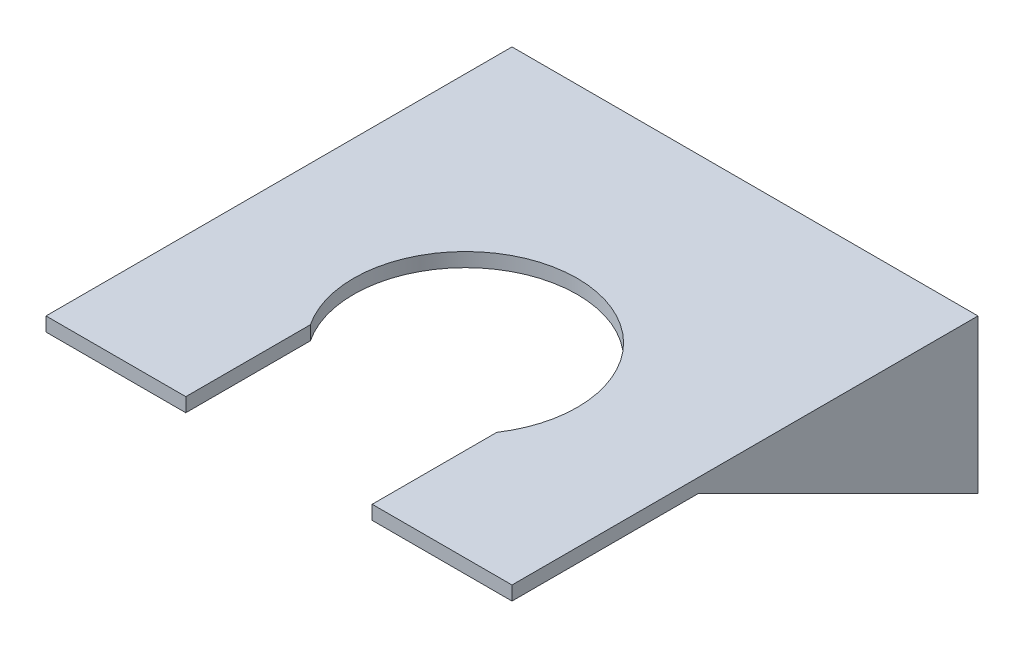
ISO-10303-21;
HEADER;
FILE_DESCRIPTION(('STEP AP214'),'2;1');
FILE_NAME('part.step','',(''),(''),'','','');
FILE_SCHEMA(('AUTOMOTIVE_DESIGN { 1 0 10303 214 1 1 1 1 }'));
ENDSEC;
DATA;
#1=APPLICATION_CONTEXT('core data for automotive mechanical design processes');
#2=APPLICATION_PROTOCOL_DEFINITION('international standard','automotive_design',2000,#1);
#3=PRODUCT_CONTEXT('',#1,'mechanical');
#4=PRODUCT('Part','Part','',(#3));
#5=PRODUCT_RELATED_PRODUCT_CATEGORY('part','',(#4));
#6=PRODUCT_DEFINITION_FORMATION('','',#4);
#7=PRODUCT_DEFINITION_CONTEXT('part definition',#1,'design');
#8=PRODUCT_DEFINITION('design','',#6,#7);
#9=PRODUCT_DEFINITION_SHAPE('','',#8);
#10=(LENGTH_UNIT() NAMED_UNIT(*) SI_UNIT(.MILLI.,.METRE.));
#11=(NAMED_UNIT(*) PLANE_ANGLE_UNIT() SI_UNIT($,.RADIAN.));
#12=(NAMED_UNIT(*) SI_UNIT($,.STERADIAN.) SOLID_ANGLE_UNIT());
#13=UNCERTAINTY_MEASURE_WITH_UNIT(LENGTH_MEASURE(1.E-05),#10,'distance_accuracy_value','');
#14=(GEOMETRIC_REPRESENTATION_CONTEXT(3) GLOBAL_UNCERTAINTY_ASSIGNED_CONTEXT((#13)) GLOBAL_UNIT_ASSIGNED_CONTEXT((#10,
#11,#12)) REPRESENTATION_CONTEXT('',''));
#15=CARTESIAN_POINT('',(0.,0.,0.));
#16=DIRECTION('',(0.,0.,1.));
#17=DIRECTION('',(1.,0.,0.));
#18=AXIS2_PLACEMENT_3D('',#15,#16,#17);
#19=CARTESIAN_POINT('',(-25.,-2.56176848089127,50.));
#20=DIRECTION('',(0.,1.,0.));
#21=DIRECTION('',(-1.,0.,0.));
#22=AXIS2_PLACEMENT_3D('',#19,#20,#21);
#23=PLANE('',#22);
#24=DIRECTION('',(1.,0.,0.));
#25=VECTOR('',#24,1.);
#26=CARTESIAN_POINT('',(23.5,-2.56176848089129,30.));
#27=LINE('',#26,#25);
#28=CARTESIAN_POINT('',(23.5,-2.56176848089126,30.));
#29=VERTEX_POINT('',#28);
#30=CARTESIAN_POINT('',(25.,-2.56176848089126,30.));
#31=VERTEX_POINT('',#30);
#32=EDGE_CURVE('E53',#29,#31,#27,.T.);
#33=ORIENTED_EDGE('',*,*,#32,.T.);
#34=DIRECTION('',(0.,0.,-1.));
#35=VECTOR('',#34,1.);
#36=CARTESIAN_POINT('',(25.,-2.56176848089126,50.));
#37=LINE('',#36,#35);
#38=CARTESIAN_POINT('',(25.,-2.56176848089126,50.));
#39=VERTEX_POINT('',#38);
#40=EDGE_CURVE('E41',#39,#31,#37,.T.);
#41=ORIENTED_EDGE('',*,*,#40,.F.);
#42=DIRECTION('',(1.,0.,0.));
#43=VECTOR('',#42,1.);
#44=CARTESIAN_POINT('',(-25.,-2.56176848089127,50.));
#45=LINE('',#44,#43);
#46=CARTESIAN_POINT('',(10.,-2.56176848089127,50.));
#47=VERTEX_POINT('',#46);
#48=EDGE_CURVE('E190',#47,#39,#45,.T.);
#49=ORIENTED_EDGE('',*,*,#48,.F.);
#50=DIRECTION('',(0.,0.,1.));
#51=VECTOR('',#50,1.);
#52=CARTESIAN_POINT('',(10.,-2.56176848089126,36.6332495807108));
#53=LINE('',#52,#51);
#54=CARTESIAN_POINT('',(10.,-2.56176848089126,36.6332495807108));
#55=VERTEX_POINT('',#54);
#56=EDGE_CURVE('E164',#55,#47,#53,.T.);
#57=ORIENTED_EDGE('',*,*,#56,.F.);
#58=CARTESIAN_POINT('',(0.,-2.56176848089126,30.));
#59=DIRECTION('',(0.,1.,0.));
#60=DIRECTION('',(-1.,0.,0.));
#61=AXIS2_PLACEMENT_3D('',#58,#59,#60);
#62=CIRCLE('',#61,12.);
#63=CARTESIAN_POINT('',(-10.,-2.56176848089127,36.6332495807108));
#64=VERTEX_POINT('',#63);
#65=EDGE_CURVE('E166',#64,#55,#62,.F.);
#66=ORIENTED_EDGE('',*,*,#65,.F.);
#67=DIRECTION('',(0.,0.,-1.));
#68=VECTOR('',#67,1.);
#69=CARTESIAN_POINT('',(-10.,-2.56176848089127,36.6332495807108));
#70=LINE('',#69,#68);
#71=CARTESIAN_POINT('',(-10.,-2.56176848089127,50.));
#72=VERTEX_POINT('',#71);
#73=EDGE_CURVE('E169',#72,#64,#70,.T.);
#74=ORIENTED_EDGE('',*,*,#73,.F.);
#75=CARTESIAN_POINT('',(-25.,-2.56176848089127,50.));
#76=VERTEX_POINT('',#75);
#77=EDGE_CURVE('E192',#76,#72,#45,.T.);
#78=ORIENTED_EDGE('',*,*,#77,.F.);
#79=DIRECTION('',(0.,0.,-1.));
#80=VECTOR('',#79,1.);
#81=CARTESIAN_POINT('',(-25.,-2.56176848089127,50.));
#82=LINE('',#81,#80);
#83=CARTESIAN_POINT('',(-25.,-2.56176848089129,30.));
#84=VERTEX_POINT('',#83);
#85=EDGE_CURVE('E11',#76,#84,#82,.T.);
#86=ORIENTED_EDGE('',*,*,#85,.T.);
#87=DIRECTION('',(-1.,0.,0.));
#88=VECTOR('',#87,1.);
#89=CARTESIAN_POINT('',(-23.5,-2.56176848089129,30.));
#90=LINE('',#89,#88);
#91=CARTESIAN_POINT('',(-23.5,-2.56176848089129,30.));
#92=VERTEX_POINT('',#91);
#93=EDGE_CURVE('E159',#92,#84,#90,.T.);
#94=ORIENTED_EDGE('',*,*,#93,.F.);
#95=DIRECTION('',(0.,0.,-1.));
#96=VECTOR('',#95,1.);
#97=CARTESIAN_POINT('',(-23.5,-2.56176848089129,30.));
#98=LINE('',#97,#96);
#99=CARTESIAN_POINT('',(-23.5,-2.56176848089127,0.));
#100=VERTEX_POINT('',#99);
#101=EDGE_CURVE('E147',#92,#100,#98,.T.);
#102=ORIENTED_EDGE('',*,*,#101,.T.);
#103=DIRECTION('',(1.,0.,0.));
#104=VECTOR('',#103,1.);
#105=CARTESIAN_POINT('',(-25.,-2.56176848089127,0.));
#106=LINE('',#105,#104);
#107=CARTESIAN_POINT('',(23.5,-2.56176848089126,0.));
#108=VERTEX_POINT('',#107);
#109=EDGE_CURVE('E203',#100,#108,#106,.T.);
#110=ORIENTED_EDGE('',*,*,#109,.T.);
#111=DIRECTION('',(0.,0.,-1.));
#112=VECTOR('',#111,1.);
#113=CARTESIAN_POINT('',(23.5,-2.56176848089129,30.));
#114=LINE('',#113,#112);
#115=EDGE_CURVE('E48',#29,#108,#114,.T.);
#116=ORIENTED_EDGE('',*,*,#115,.F.);
#117=EDGE_LOOP('',(#33,#41,#49,#57,#66,#74,#78,#86,#94,#102,#110,#116));
#118=FACE_BOUND('',#117,.T.);
#119=ADVANCED_FACE('F33',(#118),#23,.F.);
#120=CARTESIAN_POINT('',(0.,0.,50.));
#121=DIRECTION('',(0.,0.,1.));
#122=DIRECTION('',(1.,0.,0.));
#123=AXIS2_PLACEMENT_3D('',#120,#121,#122);
#124=PLANE('',#123);
#125=DIRECTION('',(0.,1.,0.));
#126=VECTOR('',#125,1.);
#127=CARTESIAN_POINT('',(10.,-42.5617684808913,50.));
#128=LINE('',#127,#126);
#129=CARTESIAN_POINT('',(10.,-1.06176848089127,50.));
#130=VERTEX_POINT('',#129);
#131=EDGE_CURVE('E179',#47,#130,#128,.T.);
#132=ORIENTED_EDGE('',*,*,#131,.F.);
#133=ORIENTED_EDGE('',*,*,#48,.T.);
#134=DIRECTION('',(0.,1.,0.));
#135=VECTOR('',#134,1.);
#136=CARTESIAN_POINT('',(25.,-1.06176848089126,50.));
#137=LINE('',#136,#135);
#138=CARTESIAN_POINT('',(25.,-1.06176848089126,50.));
#139=VERTEX_POINT('',#138);
#140=EDGE_CURVE('E195',#39,#139,#137,.T.);
#141=ORIENTED_EDGE('',*,*,#140,.T.);
#142=DIRECTION('',(-1.,0.,0.));
#143=VECTOR('',#142,1.);
#144=CARTESIAN_POINT('',(-25.,-1.06176848089127,50.));
#145=LINE('',#144,#143);
#146=EDGE_CURVE('E198',#139,#130,#145,.T.);
#147=ORIENTED_EDGE('',*,*,#146,.T.);
#148=EDGE_LOOP('',(#132,#133,#141,#147));
#149=FACE_BOUND('',#148,.T.);
#150=ADVANCED_FACE('F220',(#149),#124,.T.);
#151=CARTESIAN_POINT('',(-25.,-1.06176848089127,50.));
#152=DIRECTION('',(1.,0.,0.));
#153=DIRECTION('',(0.,0.,-1.));
#154=AXIS2_PLACEMENT_3D('',#151,#152,#153);
#155=PLANE('',#154);
#156=DIRECTION('',(0.,-1.,0.));
#157=VECTOR('',#156,1.);
#158=CARTESIAN_POINT('',(-25.,-1.06176848089127,0.));
#159=LINE('',#158,#157);
#160=CARTESIAN_POINT('',(-25.,-1.06176848089127,0.));
#161=VERTEX_POINT('',#160);
#162=CARTESIAN_POINT('',(-25.,-17.5617684808913,0.));
#163=VERTEX_POINT('',#162);
#164=EDGE_CURVE('E186',#161,#163,#159,.T.);
#165=ORIENTED_EDGE('',*,*,#164,.T.);
#166=DIRECTION('',(0.,0.447213595499958,0.894427190999916));
#167=VECTOR('',#166,1.);
#168=CARTESIAN_POINT('',(-25.,-17.5617684808913,0.));
#169=LINE('',#168,#167);
#170=EDGE_CURVE('E138',#163,#84,#169,.T.);
#171=ORIENTED_EDGE('',*,*,#170,.T.);
#172=ORIENTED_EDGE('',*,*,#85,.F.);
#173=DIRECTION('',(0.,-1.,0.));
#174=VECTOR('',#173,1.);
#175=CARTESIAN_POINT('',(-25.,-1.06176848089127,50.));
#176=LINE('',#175,#174);
#177=CARTESIAN_POINT('',(-25.,-1.06176848089127,50.));
#178=VERTEX_POINT('',#177);
#179=EDGE_CURVE('E187',#178,#76,#176,.T.);
#180=ORIENTED_EDGE('',*,*,#179,.F.);
#181=DIRECTION('',(0.,0.,-1.));
#182=VECTOR('',#181,1.);
#183=CARTESIAN_POINT('',(-25.,-1.06176848089127,50.));
#184=LINE('',#183,#182);
#185=EDGE_CURVE('E201',#178,#161,#184,.T.);
#186=ORIENTED_EDGE('',*,*,#185,.T.);
#187=EDGE_LOOP('',(#165,#171,#172,#180,#186));
#188=FACE_BOUND('',#187,.T.);
#189=ADVANCED_FACE('F35',(#188),#155,.F.);
#190=CARTESIAN_POINT('',(25.,-1.06176848089126,50.));
#191=DIRECTION('',(-1.,0.,0.));
#192=DIRECTION('',(0.,0.,1.));
#193=AXIS2_PLACEMENT_3D('',#190,#191,#192);
#194=PLANE('',#193);
#195=DIRECTION('',(0.,1.,0.));
#196=VECTOR('',#195,1.);
#197=CARTESIAN_POINT('',(25.,-1.06176848089126,0.));
#198=LINE('',#197,#196);
#199=CARTESIAN_POINT('',(25.,-17.5617684808913,0.));
#200=VERTEX_POINT('',#199);
#201=CARTESIAN_POINT('',(25.,-1.06176848089126,0.));
#202=VERTEX_POINT('',#201);
#203=EDGE_CURVE('E134',#200,#202,#198,.T.);
#204=ORIENTED_EDGE('',*,*,#203,.T.);
#205=DIRECTION('',(0.,0.,-1.));
#206=VECTOR('',#205,1.);
#207=CARTESIAN_POINT('',(25.,-1.06176848089126,50.));
#208=LINE('',#207,#206);
#209=EDGE_CURVE('E209',#139,#202,#208,.T.);
#210=ORIENTED_EDGE('',*,*,#209,.F.);
#211=ORIENTED_EDGE('',*,*,#140,.F.);
#212=ORIENTED_EDGE('',*,*,#40,.T.);
#213=DIRECTION('',(0.,0.447213595499958,0.894427190999916));
#214=VECTOR('',#213,1.);
#215=CARTESIAN_POINT('',(25.,-17.5617684808913,0.));
#216=LINE('',#215,#214);
#217=EDGE_CURVE('E142',#200,#31,#216,.T.);
#218=ORIENTED_EDGE('',*,*,#217,.F.);
#219=EDGE_LOOP('',(#204,#210,#211,#212,#218));
#220=FACE_BOUND('',#219,.T.);
#221=ADVANCED_FACE('F213',(#220),#194,.F.);
#222=CARTESIAN_POINT('',(-25.,-1.06176848089127,50.));
#223=DIRECTION('',(0.,-1.,0.));
#224=DIRECTION('',(1.,0.,0.));
#225=AXIS2_PLACEMENT_3D('',#222,#223,#224);
#226=PLANE('',#225);
#227=CARTESIAN_POINT('',(0.,-1.06176848089127,30.));
#228=DIRECTION('',(0.,1.,0.));
#229=DIRECTION('',(0.,0.,1.));
#230=AXIS2_PLACEMENT_3D('',#227,#228,#229);
#231=CIRCLE('',#230,12.);
#232=CARTESIAN_POINT('',(10.,-1.06176848089127,36.6332495807108));
#233=VERTEX_POINT('',#232);
#234=CARTESIAN_POINT('',(-10.,-1.06176848089127,36.6332495807108));
#235=VERTEX_POINT('',#234);
#236=EDGE_CURVE('E161',#233,#235,#231,.T.);
#237=ORIENTED_EDGE('',*,*,#236,.F.);
#238=DIRECTION('',(0.,0.,-1.));
#239=VECTOR('',#238,1.);
#240=CARTESIAN_POINT('',(10.,-1.06176848089127,36.6332495807108));
#241=LINE('',#240,#239);
#242=EDGE_CURVE('E174',#130,#233,#241,.T.);
#243=ORIENTED_EDGE('',*,*,#242,.F.);
#244=ORIENTED_EDGE('',*,*,#146,.F.);
#245=ORIENTED_EDGE('',*,*,#209,.T.);
#246=DIRECTION('',(-1.,0.,0.));
#247=VECTOR('',#246,1.);
#248=CARTESIAN_POINT('',(-25.,-1.06176848089127,0.));
#249=LINE('',#248,#247);
#250=EDGE_CURVE('E191',#202,#161,#249,.T.);
#251=ORIENTED_EDGE('',*,*,#250,.T.);
#252=ORIENTED_EDGE('',*,*,#185,.F.);
#253=CARTESIAN_POINT('',(-10.,-1.06176848089127,50.));
#254=VERTEX_POINT('',#253);
#255=EDGE_CURVE('E197',#254,#178,#145,.T.);
#256=ORIENTED_EDGE('',*,*,#255,.F.);
#257=DIRECTION('',(0.,0.,1.));
#258=VECTOR('',#257,1.);
#259=CARTESIAN_POINT('',(-10.,-1.06176848089127,36.6332495807108));
#260=LINE('',#259,#258);
#261=EDGE_CURVE('E172',#235,#254,#260,.T.);
#262=ORIENTED_EDGE('',*,*,#261,.F.);
#263=EDGE_LOOP('',(#237,#243,#244,#245,#251,#252,#256,#262));
#264=FACE_BOUND('',#263,.T.);
#265=ADVANCED_FACE('F228',(#264),#226,.F.);
#266=DIRECTION('',(0.,1.,0.));
#267=VECTOR('',#266,1.);
#268=CARTESIAN_POINT('',(-10.,-42.5617684808913,50.));
#269=LINE('',#268,#267);
#270=EDGE_CURVE('E181',#72,#254,#269,.T.);
#271=ORIENTED_EDGE('',*,*,#270,.T.);
#272=ORIENTED_EDGE('',*,*,#255,.T.);
#273=ORIENTED_EDGE('',*,*,#179,.T.);
#274=ORIENTED_EDGE('',*,*,#77,.T.);
#275=EDGE_LOOP('',(#271,#272,#273,#274));
#276=FACE_BOUND('',#275,.T.);
#277=ADVANCED_FACE('F237',(#276),#124,.T.);
#278=CARTESIAN_POINT('',(0.,0.,0.));
#279=DIRECTION('',(0.,0.,1.));
#280=DIRECTION('',(1.,0.,0.));
#281=AXIS2_PLACEMENT_3D('',#278,#279,#280);
#282=PLANE('',#281);
#283=ORIENTED_EDGE('',*,*,#164,.F.);
#284=ORIENTED_EDGE('',*,*,#250,.F.);
#285=ORIENTED_EDGE('',*,*,#203,.F.);
#286=DIRECTION('',(1.,0.,0.));
#287=VECTOR('',#286,1.);
#288=CARTESIAN_POINT('',(23.5,-17.5617684808913,0.));
#289=LINE('',#288,#287);
#290=CARTESIAN_POINT('',(23.5,-17.5617684808913,0.));
#291=VERTEX_POINT('',#290);
#292=EDGE_CURVE('E130',#291,#200,#289,.T.);
#293=ORIENTED_EDGE('',*,*,#292,.F.);
#294=DIRECTION('',(0.,-1.,0.));
#295=VECTOR('',#294,1.);
#296=CARTESIAN_POINT('',(23.5,-2.56176848089129,0.));
#297=LINE('',#296,#295);
#298=EDGE_CURVE('E121',#108,#291,#297,.T.);
#299=ORIENTED_EDGE('',*,*,#298,.F.);
#300=ORIENTED_EDGE('',*,*,#109,.F.);
#301=DIRECTION('',(0.,-1.,0.));
#302=VECTOR('',#301,1.);
#303=CARTESIAN_POINT('',(-23.5,-2.56176848089129,0.));
#304=LINE('',#303,#302);
#305=CARTESIAN_POINT('',(-23.5,-17.5617684808913,0.));
#306=VERTEX_POINT('',#305);
#307=EDGE_CURVE('E150',#100,#306,#304,.T.);
#308=ORIENTED_EDGE('',*,*,#307,.T.);
#309=DIRECTION('',(-1.,0.,0.));
#310=VECTOR('',#309,1.);
#311=CARTESIAN_POINT('',(-23.5,-17.5617684808913,0.));
#312=LINE('',#311,#310);
#313=EDGE_CURVE('E156',#306,#163,#312,.T.);
#314=ORIENTED_EDGE('',*,*,#313,.T.);
#315=EDGE_LOOP('',(#283,#284,#285,#293,#299,#300,#308,#314));
#316=FACE_BOUND('',#315,.T.);
#317=ADVANCED_FACE('F132',(#316),#282,.F.);
#318=CARTESIAN_POINT('',(0.,-42.5617684808913,30.));
#319=DIRECTION('',(0.,1.,0.));
#320=DIRECTION('',(0.,0.,1.));
#321=AXIS2_PLACEMENT_3D('',#318,#319,#320);
#322=CYLINDRICAL_SURFACE('',#321,12.);
#323=ORIENTED_EDGE('',*,*,#65,.T.);
#324=DIRECTION('',(0.,1.,0.));
#325=VECTOR('',#324,1.);
#326=CARTESIAN_POINT('',(10.,-42.5617684808913,36.6332495807108));
#327=LINE('',#326,#325);
#328=EDGE_CURVE('E167',#55,#233,#327,.T.);
#329=ORIENTED_EDGE('',*,*,#328,.T.);
#330=ORIENTED_EDGE('',*,*,#236,.T.);
#331=DIRECTION('',(0.,1.,0.));
#332=VECTOR('',#331,1.);
#333=CARTESIAN_POINT('',(-10.,-42.5617684808913,36.6332495807108));
#334=LINE('',#333,#332);
#335=EDGE_CURVE('E177',#64,#235,#334,.T.);
#336=ORIENTED_EDGE('',*,*,#335,.F.);
#337=EDGE_LOOP('',(#323,#329,#330,#336));
#338=FACE_BOUND('',#337,.T.);
#339=ADVANCED_FACE('F233',(#338),#322,.F.);
#340=CARTESIAN_POINT('',(10.,-42.5617684808913,36.6332495807108));
#341=DIRECTION('',(1.,0.,0.));
#342=DIRECTION('',(0.,0.,-1.));
#343=AXIS2_PLACEMENT_3D('',#340,#341,#342);
#344=PLANE('',#343);
#345=ORIENTED_EDGE('',*,*,#56,.T.);
#346=ORIENTED_EDGE('',*,*,#131,.T.);
#347=ORIENTED_EDGE('',*,*,#242,.T.);
#348=ORIENTED_EDGE('',*,*,#328,.F.);
#349=EDGE_LOOP('',(#345,#346,#347,#348));
#350=FACE_BOUND('',#349,.T.);
#351=ADVANCED_FACE('F224',(#350),#344,.F.);
#352=CARTESIAN_POINT('',(-10.,-42.5617684808913,36.6332495807108));
#353=DIRECTION('',(-1.,0.,0.));
#354=DIRECTION('',(0.,0.,1.));
#355=AXIS2_PLACEMENT_3D('',#352,#353,#354);
#356=PLANE('',#355);
#357=ORIENTED_EDGE('',*,*,#73,.T.);
#358=ORIENTED_EDGE('',*,*,#335,.T.);
#359=ORIENTED_EDGE('',*,*,#261,.T.);
#360=ORIENTED_EDGE('',*,*,#270,.F.);
#361=EDGE_LOOP('',(#357,#358,#359,#360));
#362=FACE_BOUND('',#361,.T.);
#363=ADVANCED_FACE('F256',(#362),#356,.F.);
#364=CARTESIAN_POINT('',(-23.5,-17.5617684808913,0.));
#365=DIRECTION('',(0.,-0.894427190999916,0.447213595499958));
#366=DIRECTION('',(0.,-0.447213595499958,-0.894427190999916));
#367=AXIS2_PLACEMENT_3D('',#364,#365,#366);
#368=PLANE('',#367);
#369=ORIENTED_EDGE('',*,*,#170,.F.);
#370=ORIENTED_EDGE('',*,*,#313,.F.);
#371=DIRECTION('',(0.,0.447213595499958,0.894427190999916));
#372=VECTOR('',#371,1.);
#373=CARTESIAN_POINT('',(-23.5,-17.5617684808913,0.));
#374=LINE('',#373,#372);
#375=EDGE_CURVE('E153',#306,#92,#374,.T.);
#376=ORIENTED_EDGE('',*,*,#375,.T.);
#377=ORIENTED_EDGE('',*,*,#93,.T.);
#378=EDGE_LOOP('',(#369,#370,#376,#377));
#379=FACE_BOUND('',#378,.T.);
#380=ADVANCED_FACE('F245',(#379),#368,.T.);
#381=CARTESIAN_POINT('',(-23.5,0.,0.));
#382=DIRECTION('',(-1.,0.,0.));
#383=DIRECTION('',(0.,0.,1.));
#384=AXIS2_PLACEMENT_3D('',#381,#382,#383);
#385=PLANE('',#384);
#386=ORIENTED_EDGE('',*,*,#101,.F.);
#387=ORIENTED_EDGE('',*,*,#375,.F.);
#388=ORIENTED_EDGE('',*,*,#307,.F.);
#389=EDGE_LOOP('',(#386,#387,#388));
#390=FACE_BOUND('',#389,.T.);
#391=ADVANCED_FACE('F248',(#390),#385,.F.);
#392=CARTESIAN_POINT('',(23.5,-17.5617684808913,0.));
#393=DIRECTION('',(0.,0.894427190999916,-0.447213595499958));
#394=DIRECTION('',(0.,0.447213595499958,0.894427190999916));
#395=AXIS2_PLACEMENT_3D('',#392,#393,#394);
#396=PLANE('',#395);
#397=ORIENTED_EDGE('',*,*,#217,.T.);
#398=ORIENTED_EDGE('',*,*,#32,.F.);
#399=DIRECTION('',(0.,0.447213595499958,0.894427190999916));
#400=VECTOR('',#399,1.);
#401=CARTESIAN_POINT('',(23.5,-17.5617684808913,0.));
#402=LINE('',#401,#400);
#403=EDGE_CURVE('E125',#291,#29,#402,.T.);
#404=ORIENTED_EDGE('',*,*,#403,.F.);
#405=ORIENTED_EDGE('',*,*,#292,.T.);
#406=EDGE_LOOP('',(#397,#398,#404,#405));
#407=FACE_BOUND('',#406,.T.);
#408=ADVANCED_FACE('F140',(#407),#396,.F.);
#409=CARTESIAN_POINT('',(23.5,0.,0.));
#410=DIRECTION('',(1.,0.,0.));
#411=DIRECTION('',(0.,0.,1.));
#412=AXIS2_PLACEMENT_3D('',#409,#410,#411);
#413=PLANE('',#412);
#414=ORIENTED_EDGE('',*,*,#115,.T.);
#415=ORIENTED_EDGE('',*,*,#298,.T.);
#416=ORIENTED_EDGE('',*,*,#403,.T.);
#417=EDGE_LOOP('',(#414,#415,#416));
#418=FACE_BOUND('',#417,.T.);
#419=ADVANCED_FACE('F123',(#418),#413,.F.);
#420=CLOSED_SHELL('',(#119,#150,#189,#221,#265,#277,#317,#339,#351,#363,#380,#391,#408,#419));
#421=MANIFOLD_SOLID_BREP('B2',#420);
#422=ADVANCED_BREP_SHAPE_REPRESENTATION('',(#18,#421),#14);
#423=SHAPE_DEFINITION_REPRESENTATION(#9,#422);
ENDSEC;
END-ISO-10303-21;
